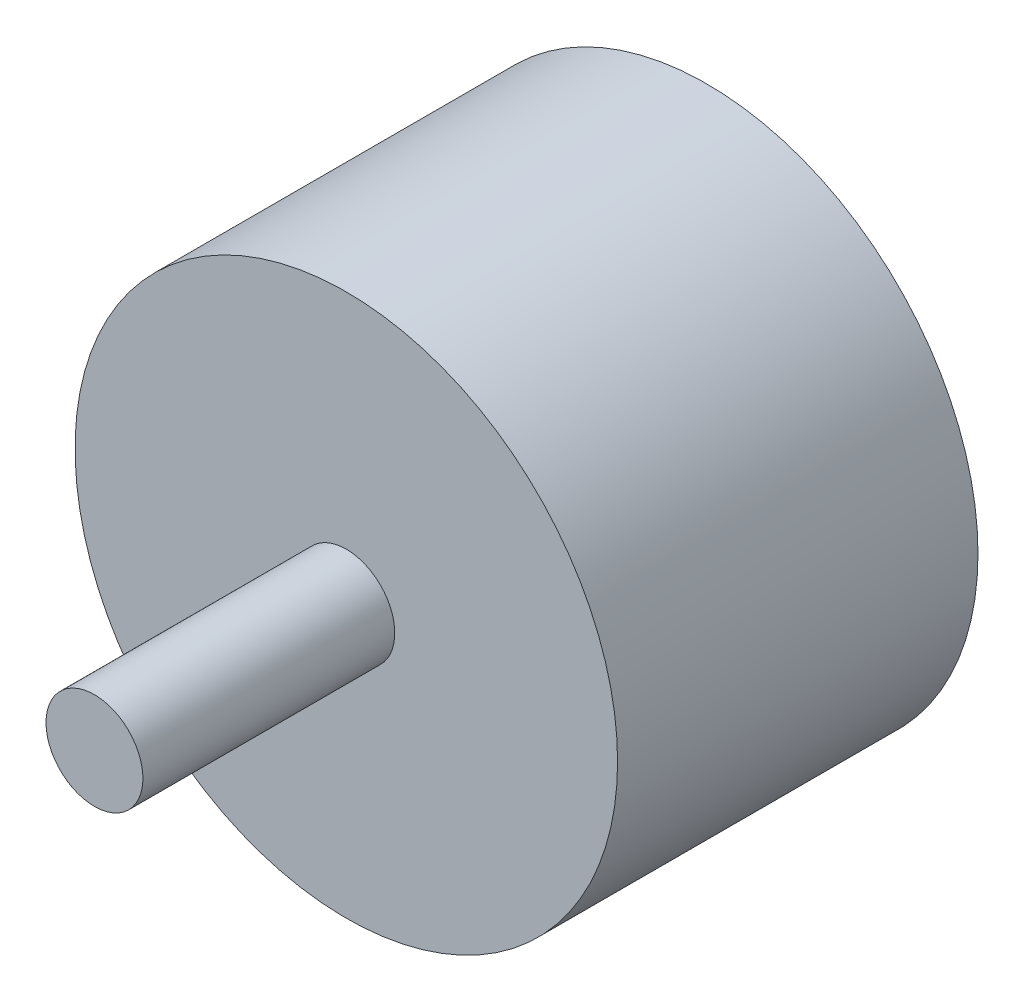
ISO-10303-21;
HEADER;
FILE_DESCRIPTION(('STEP AP214'),'2;1');
FILE_NAME('part.step','',(''),(''),'','','');
FILE_SCHEMA(('AUTOMOTIVE_DESIGN { 1 0 10303 214 1 1 1 1 }'));
ENDSEC;
DATA;
#1=APPLICATION_CONTEXT('core data for automotive mechanical design processes');
#2=APPLICATION_PROTOCOL_DEFINITION('international standard','automotive_design',2000,#1);
#3=PRODUCT_CONTEXT('',#1,'mechanical');
#4=PRODUCT('Part','Part','',(#3));
#5=PRODUCT_RELATED_PRODUCT_CATEGORY('part','',(#4));
#6=PRODUCT_DEFINITION_FORMATION('','',#4);
#7=PRODUCT_DEFINITION_CONTEXT('part definition',#1,'design');
#8=PRODUCT_DEFINITION('design','',#6,#7);
#9=PRODUCT_DEFINITION_SHAPE('','',#8);
#10=(LENGTH_UNIT() NAMED_UNIT(*) SI_UNIT(.MILLI.,.METRE.));
#11=(NAMED_UNIT(*) PLANE_ANGLE_UNIT() SI_UNIT($,.RADIAN.));
#12=(NAMED_UNIT(*) SI_UNIT($,.STERADIAN.) SOLID_ANGLE_UNIT());
#13=UNCERTAINTY_MEASURE_WITH_UNIT(LENGTH_MEASURE(1.E-05),#10,'distance_accuracy_value','');
#14=(GEOMETRIC_REPRESENTATION_CONTEXT(3) GLOBAL_UNCERTAINTY_ASSIGNED_CONTEXT((#13)) GLOBAL_UNIT_ASSIGNED_CONTEXT((#10,
#11,#12)) REPRESENTATION_CONTEXT('',''));
#15=CARTESIAN_POINT('',(0.,0.,0.));
#16=DIRECTION('',(0.,0.,1.));
#17=DIRECTION('',(1.,0.,0.));
#18=AXIS2_PLACEMENT_3D('',#15,#16,#17);
#19=CARTESIAN_POINT('',(0.,0.,18.6));
#20=DIRECTION('',(0.,0.,-1.));
#21=DIRECTION('',(-1.,0.,0.));
#22=AXIS2_PLACEMENT_3D('',#19,#20,#21);
#23=CYLINDRICAL_SURFACE('',#22,14.);
#24=CARTESIAN_POINT('',(0.,0.,18.6));
#25=DIRECTION('',(0.,0.,1.));
#26=DIRECTION('',(1.,0.,0.));
#27=AXIS2_PLACEMENT_3D('',#24,#25,#26);
#28=CIRCLE('',#27,14.);
#29=CARTESIAN_POINT('',(14.,0.,18.6));
#30=VERTEX_POINT('',#29);
#31=EDGE_CURVE('E45',#30,#30,#28,.T.);
#32=ORIENTED_EDGE('',*,*,#31,.F.);
#33=EDGE_LOOP('',(#32));
#34=FACE_BOUND('',#33,.T.);
#35=CARTESIAN_POINT('',(0.,0.,0.));
#36=DIRECTION('',(0.,0.,1.));
#37=DIRECTION('',(1.,0.,0.));
#38=AXIS2_PLACEMENT_3D('',#35,#36,#37);
#39=CIRCLE('',#38,14.);
#40=CARTESIAN_POINT('',(14.,0.,0.));
#41=VERTEX_POINT('',#40);
#42=EDGE_CURVE('E40',#41,#41,#39,.T.);
#43=ORIENTED_EDGE('',*,*,#42,.T.);
#44=EDGE_LOOP('',(#43));
#45=FACE_BOUND('',#44,.T.);
#46=ADVANCED_FACE('F37',(#34,#45),#23,.T.);
#47=CARTESIAN_POINT('',(0.,0.,18.6));
#48=DIRECTION('',(0.,0.,1.));
#49=DIRECTION('',(1.,0.,0.));
#50=AXIS2_PLACEMENT_3D('',#47,#48,#49);
#51=PLANE('',#50);
#52=CARTESIAN_POINT('',(0.,0.,18.6));
#53=DIRECTION('',(0.,0.,1.));
#54=DIRECTION('',(1.,0.,0.));
#55=AXIS2_PLACEMENT_3D('',#52,#53,#54);
#56=CIRCLE('',#55,2.5);
#57=CARTESIAN_POINT('',(-2.5,0.,18.6));
#58=VERTEX_POINT('',#57);
#59=EDGE_CURVE('E10',#58,#58,#56,.T.);
#60=ORIENTED_EDGE('',*,*,#59,.F.);
#61=EDGE_LOOP('',(#60));
#62=FACE_BOUND('',#61,.T.);
#63=ORIENTED_EDGE('',*,*,#31,.T.);
#64=EDGE_LOOP('',(#63));
#65=FACE_BOUND('',#64,.T.);
#66=ADVANCED_FACE('F65',(#62,#65),#51,.T.);
#67=CARTESIAN_POINT('',(0.,0.,0.));
#68=DIRECTION('',(0.,0.,1.));
#69=DIRECTION('',(1.,0.,0.));
#70=AXIS2_PLACEMENT_3D('',#67,#68,#69);
#71=PLANE('',#70);
#72=ORIENTED_EDGE('',*,*,#42,.F.);
#73=EDGE_LOOP('',(#72));
#74=FACE_BOUND('',#73,.T.);
#75=ADVANCED_FACE('F62',(#74),#71,.F.);
#76=CARTESIAN_POINT('',(0.,0.,31.6));
#77=DIRECTION('',(0.,0.,-1.));
#78=DIRECTION('',(-1.,0.,0.));
#79=AXIS2_PLACEMENT_3D('',#76,#77,#78);
#80=CYLINDRICAL_SURFACE('',#79,2.5);
#81=CARTESIAN_POINT('',(0.,0.,31.6));
#82=DIRECTION('',(0.,0.,1.));
#83=DIRECTION('',(1.,0.,0.));
#84=AXIS2_PLACEMENT_3D('',#81,#82,#83);
#85=CIRCLE('',#84,2.5);
#86=CARTESIAN_POINT('',(-2.5,0.,31.6));
#87=VERTEX_POINT('',#86);
#88=EDGE_CURVE('E52',#87,#87,#85,.T.);
#89=CARTESIAN_POINT('',(-2.5,0.,31.6));
#90=CARTESIAN_POINT('',(-2.5,0.,31.4645833333333));
#91=CARTESIAN_POINT('',(-2.5,0.,31.3291666666667));
#92=CARTESIAN_POINT('',(-2.5,0.,31.0583333333333));
#93=CARTESIAN_POINT('',(-2.5,0.,30.9229166666667));
#94=CARTESIAN_POINT('',(-2.5,0.,30.6520833333333));
#95=CARTESIAN_POINT('',(-2.5,0.,30.5166666666667));
#96=CARTESIAN_POINT('',(-2.5,0.,30.2458333333333));
#97=CARTESIAN_POINT('',(-2.5,0.,30.1104166666667));
#98=CARTESIAN_POINT('',(-2.5,0.,29.8395833333333));
#99=CARTESIAN_POINT('',(-2.5,0.,29.7041666666667));
#100=CARTESIAN_POINT('',(-2.5,0.,29.4333333333333));
#101=CARTESIAN_POINT('',(-2.5,0.,29.2979166666667));
#102=CARTESIAN_POINT('',(-2.5,0.,29.0270833333333));
#103=CARTESIAN_POINT('',(-2.5,0.,28.8916666666667));
#104=CARTESIAN_POINT('',(-2.5,0.,28.6208333333333));
#105=CARTESIAN_POINT('',(-2.5,0.,28.4854166666667));
#106=CARTESIAN_POINT('',(-2.5,0.,28.2145833333333));
#107=CARTESIAN_POINT('',(-2.5,0.,28.0791666666667));
#108=CARTESIAN_POINT('',(-2.5,0.,27.8083333333333));
#109=CARTESIAN_POINT('',(-2.5,0.,27.6729166666667));
#110=CARTESIAN_POINT('',(-2.5,0.,27.4020833333333));
#111=CARTESIAN_POINT('',(-2.5,0.,27.2666666666667));
#112=CARTESIAN_POINT('',(-2.5,0.,26.9958333333333));
#113=CARTESIAN_POINT('',(-2.5,0.,26.8604166666667));
#114=CARTESIAN_POINT('',(-2.5,0.,26.5895833333333));
#115=CARTESIAN_POINT('',(-2.5,0.,26.4541666666667));
#116=CARTESIAN_POINT('',(-2.5,0.,26.1833333333333));
#117=CARTESIAN_POINT('',(-2.5,0.,26.0479166666667));
#118=CARTESIAN_POINT('',(-2.5,0.,25.7770833333333));
#119=CARTESIAN_POINT('',(-2.5,0.,25.6416666666667));
#120=CARTESIAN_POINT('',(-2.5,0.,25.3708333333333));
#121=CARTESIAN_POINT('',(-2.5,0.,25.2354166666667));
#122=CARTESIAN_POINT('',(-2.5,0.,24.9645833333333));
#123=CARTESIAN_POINT('',(-2.5,0.,24.8291666666667));
#124=CARTESIAN_POINT('',(-2.5,0.,24.5583333333333));
#125=CARTESIAN_POINT('',(-2.5,0.,24.4229166666667));
#126=CARTESIAN_POINT('',(-2.5,0.,24.1520833333333));
#127=CARTESIAN_POINT('',(-2.5,0.,24.0166666666667));
#128=CARTESIAN_POINT('',(-2.5,0.,23.7458333333333));
#129=CARTESIAN_POINT('',(-2.5,0.,23.6104166666667));
#130=CARTESIAN_POINT('',(-2.5,0.,23.3395833333333));
#131=CARTESIAN_POINT('',(-2.5,0.,23.2041666666667));
#132=CARTESIAN_POINT('',(-2.5,0.,22.9333333333333));
#133=CARTESIAN_POINT('',(-2.5,0.,22.7979166666667));
#134=CARTESIAN_POINT('',(-2.5,0.,22.5270833333333));
#135=CARTESIAN_POINT('',(-2.5,0.,22.3916666666667));
#136=CARTESIAN_POINT('',(-2.5,0.,22.1208333333333));
#137=CARTESIAN_POINT('',(-2.5,0.,21.9854166666667));
#138=CARTESIAN_POINT('',(-2.5,0.,21.7145833333333));
#139=CARTESIAN_POINT('',(-2.5,0.,21.5791666666667));
#140=CARTESIAN_POINT('',(-2.5,0.,21.3083333333333));
#141=CARTESIAN_POINT('',(-2.5,0.,21.1729166666667));
#142=CARTESIAN_POINT('',(-2.5,0.,20.9020833333333));
#143=CARTESIAN_POINT('',(-2.5,0.,20.7666666666667));
#144=CARTESIAN_POINT('',(-2.5,0.,20.4958333333333));
#145=CARTESIAN_POINT('',(-2.5,0.,20.3604166666667));
#146=CARTESIAN_POINT('',(-2.5,0.,20.0895833333333));
#147=CARTESIAN_POINT('',(-2.5,0.,19.9541666666667));
#148=CARTESIAN_POINT('',(-2.5,0.,19.6833333333333));
#149=CARTESIAN_POINT('',(-2.5,0.,19.5479166666667));
#150=CARTESIAN_POINT('',(-2.5,0.,19.2770833333333));
#151=CARTESIAN_POINT('',(-2.5,0.,19.1416666666667));
#152=CARTESIAN_POINT('',(-2.5,0.,18.8708333333333));
#153=CARTESIAN_POINT('',(-2.5,0.,18.7354166666667));
#154=CARTESIAN_POINT('',(-2.5,0.,18.6));
#155=B_SPLINE_CURVE_WITH_KNOTS('',3,(#89,#90,#91,#92,#93,#94,#95,#96,#97,#98,#99,#100,#101,#102,
#103,#104,#105,#106,#107,#108,#109,#110,#111,#112,#113,#114,#115,#116,#117,#118,#119,#120,#121,
#122,#123,#124,#125,#126,#127,#128,#129,#130,#131,#132,#133,#134,#135,#136,#137,#138,#139,#140,
#141,#142,#143,#144,#145,#146,#147,#148,#149,#150,#151,#152,#153,#154),.UNSPECIFIED.,.F.,.F.,(4,
2,2,2,2,2,2,2,2,2,2,2,2,2,2,2,2,2,2,2,2,2,2,2,2,2,2,2,2,2,2,2,4),(0.,0.406249999999997,
0.812499999999997,1.21875,1.625,2.03124999999999,2.4375,2.84375,3.25,3.65625,4.0625,4.46875,
4.875,5.28124999999999,5.6875,6.09374999999999,6.5,6.90625,7.3125,7.71875,8.12499999999999,
8.53125,8.93749999999999,9.34375,9.74999999999999,10.15625,10.5625,10.96875,11.375,11.78125,
12.1875,12.59375,13.),.UNSPECIFIED.);
#156=EDGE_CURVE('BSEAM64',#87,#58,#155,.T.);
#157=ORIENTED_EDGE('',*,*,#88,.F.);
#158=ORIENTED_EDGE('',*,*,#59,.T.);
#159=ORIENTED_EDGE('',*,*,#156,.T.);
#160=ORIENTED_EDGE('',*,*,#156,.F.);
#161=EDGE_LOOP('',(#157,#159,#158,#160));
#162=FACE_BOUND('',#161,.T.);
#163=ADVANCED_FACE('F64',(#162),#80,.T.);
#164=CARTESIAN_POINT('',(0.,0.,31.6));
#165=DIRECTION('',(0.,0.,1.));
#166=DIRECTION('',(1.,0.,0.));
#167=AXIS2_PLACEMENT_3D('',#164,#165,#166);
#168=PLANE('',#167);
#169=ORIENTED_EDGE('',*,*,#88,.T.);
#170=EDGE_LOOP('',(#169));
#171=FACE_BOUND('',#170,.T.);
#172=ADVANCED_FACE('F70',(#171),#168,.T.);
#173=CLOSED_SHELL('',(#46,#66,#75,#163,#172));
#174=MANIFOLD_SOLID_BREP('B2',#173);
#175=ADVANCED_BREP_SHAPE_REPRESENTATION('',(#18,#174),#14);
#176=SHAPE_DEFINITION_REPRESENTATION(#9,#175);
ENDSEC;
END-ISO-10303-21;
